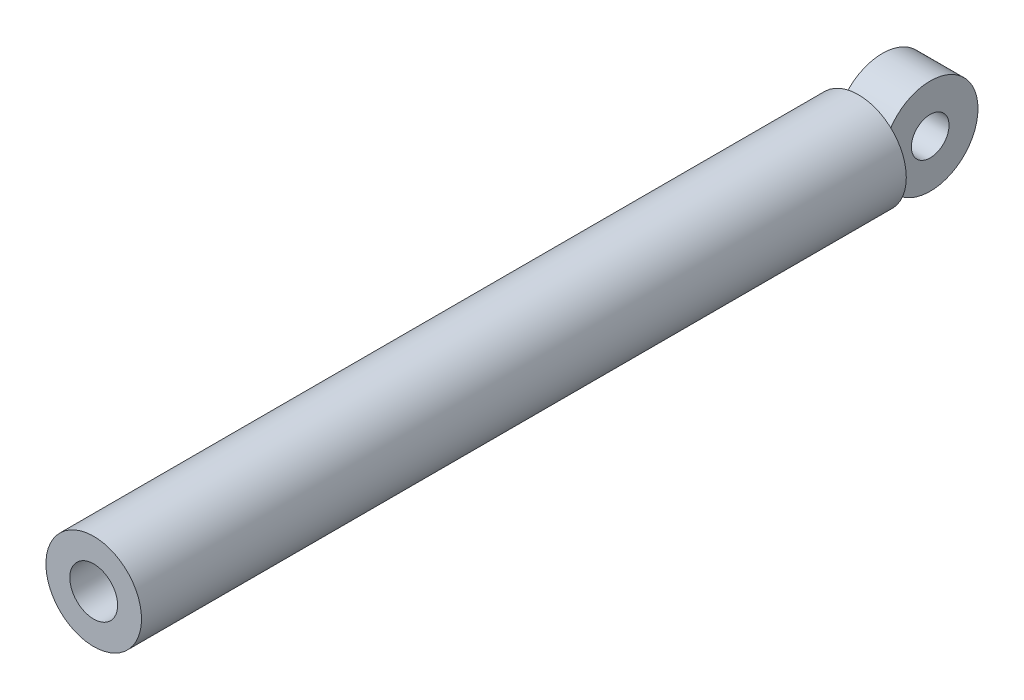
ISO-10303-21;
HEADER;
FILE_DESCRIPTION(('STEP AP214'),'2;1');
FILE_NAME('part.step','',(''),(''),'','','');
FILE_SCHEMA(('AUTOMOTIVE_DESIGN { 1 0 10303 214 1 1 1 1 }'));
ENDSEC;
DATA;
#1=APPLICATION_CONTEXT('core data for automotive mechanical design processes');
#2=APPLICATION_PROTOCOL_DEFINITION('international standard','automotive_design',2000,#1);
#3=PRODUCT_CONTEXT('',#1,'mechanical');
#4=PRODUCT('Part','Part','',(#3));
#5=PRODUCT_RELATED_PRODUCT_CATEGORY('part','',(#4));
#6=PRODUCT_DEFINITION_FORMATION('','',#4);
#7=PRODUCT_DEFINITION_CONTEXT('part definition',#1,'design');
#8=PRODUCT_DEFINITION('design','',#6,#7);
#9=PRODUCT_DEFINITION_SHAPE('','',#8);
#10=(LENGTH_UNIT() NAMED_UNIT(*) SI_UNIT(.MILLI.,.METRE.));
#11=(NAMED_UNIT(*) PLANE_ANGLE_UNIT() SI_UNIT($,.RADIAN.));
#12=(NAMED_UNIT(*) SI_UNIT($,.STERADIAN.) SOLID_ANGLE_UNIT());
#13=UNCERTAINTY_MEASURE_WITH_UNIT(LENGTH_MEASURE(1.E-05),#10,'distance_accuracy_value','');
#14=(GEOMETRIC_REPRESENTATION_CONTEXT(3) GLOBAL_UNCERTAINTY_ASSIGNED_CONTEXT((#13)) GLOBAL_UNIT_ASSIGNED_CONTEXT((#10,
#11,#12)) REPRESENTATION_CONTEXT('',''));
#15=CARTESIAN_POINT('',(0.,0.,0.));
#16=DIRECTION('',(0.,0.,1.));
#17=DIRECTION('',(1.,0.,0.));
#18=AXIS2_PLACEMENT_3D('',#15,#16,#17);
#19=CARTESIAN_POINT('',(3.175,0.,-6.35));
#20=DIRECTION('',(1.,0.,0.));
#21=DIRECTION('',(0.,0.,-1.));
#22=AXIS2_PLACEMENT_3D('',#19,#20,#21);
#23=PLANE('',#22);
#24=CARTESIAN_POINT('',(3.175,0.,-6.35));
#25=DIRECTION('',(1.,0.,0.));
#26=DIRECTION('',(0.,0.,-1.));
#27=AXIS2_PLACEMENT_3D('',#24,#25,#26);
#28=CIRCLE('',#27,6.35);
#29=CARTESIAN_POINT('',(3.175,0.,-12.7));
#30=VERTEX_POINT('',#29);
#31=EDGE_CURVE('E11',#30,#30,#28,.T.);
#32=ORIENTED_EDGE('',*,*,#31,.T.);
#33=EDGE_LOOP('',(#32));
#34=FACE_BOUND('',#33,.T.);
#35=CARTESIAN_POINT('',(3.175,0.,-6.35));
#36=DIRECTION('',(1.,0.,0.));
#37=DIRECTION('',(0.,0.,-1.));
#38=AXIS2_PLACEMENT_3D('',#35,#36,#37);
#39=CIRCLE('',#38,2.5);
#40=CARTESIAN_POINT('',(3.175,0.,-8.85));
#41=VERTEX_POINT('',#40);
#42=EDGE_CURVE('E56',#41,#41,#39,.T.);
#43=ORIENTED_EDGE('',*,*,#42,.F.);
#44=EDGE_LOOP('',(#43));
#45=FACE_BOUND('',#44,.T.);
#46=ADVANCED_FACE('F45',(#34,#45),#23,.T.);
#47=CARTESIAN_POINT('',(-3.175,0.,-6.35));
#48=DIRECTION('',(1.,0.,0.));
#49=DIRECTION('',(0.,0.,-1.));
#50=AXIS2_PLACEMENT_3D('',#47,#48,#49);
#51=PLANE('',#50);
#52=CARTESIAN_POINT('',(-3.175,0.,-6.35));
#53=DIRECTION('',(1.,0.,0.));
#54=DIRECTION('',(0.,0.,-1.));
#55=AXIS2_PLACEMENT_3D('',#52,#53,#54);
#56=CIRCLE('',#55,6.35);
#57=CARTESIAN_POINT('',(-3.175,0.,-12.7));
#58=VERTEX_POINT('',#57);
#59=EDGE_CURVE('E49',#58,#58,#56,.T.);
#60=ORIENTED_EDGE('',*,*,#59,.F.);
#61=EDGE_LOOP('',(#60));
#62=FACE_BOUND('',#61,.T.);
#63=CARTESIAN_POINT('',(-3.175,0.,-6.35));
#64=DIRECTION('',(1.,0.,0.));
#65=DIRECTION('',(0.,0.,-1.));
#66=AXIS2_PLACEMENT_3D('',#63,#64,#65);
#67=CIRCLE('',#66,2.5);
#68=CARTESIAN_POINT('',(-3.175,0.,-8.85));
#69=VERTEX_POINT('',#68);
#70=EDGE_CURVE('E58',#69,#69,#67,.T.);
#71=ORIENTED_EDGE('',*,*,#70,.T.);
#72=EDGE_LOOP('',(#71));
#73=FACE_BOUND('',#72,.T.);
#74=ADVANCED_FACE('F68',(#62,#73),#51,.F.);
#75=CARTESIAN_POINT('',(3.175,0.,-6.35));
#76=DIRECTION('',(-1.,0.,0.));
#77=DIRECTION('',(0.,0.,1.));
#78=AXIS2_PLACEMENT_3D('',#75,#76,#77);
#79=CYLINDRICAL_SURFACE('',#78,6.35);
#80=ORIENTED_EDGE('',*,*,#31,.F.);
#81=EDGE_LOOP('',(#80));
#82=FACE_BOUND('',#81,.T.);
#83=ORIENTED_EDGE('',*,*,#59,.T.);
#84=EDGE_LOOP('',(#83));
#85=FACE_BOUND('',#84,.T.);
#86=ADVANCED_FACE('F47',(#82,#85),#79,.T.);
#87=CARTESIAN_POINT('',(3.175,0.,-6.35));
#88=DIRECTION('',(-1.,0.,0.));
#89=DIRECTION('',(0.,0.,1.));
#90=AXIS2_PLACEMENT_3D('',#87,#88,#89);
#91=CYLINDRICAL_SURFACE('',#90,2.5);
#92=ORIENTED_EDGE('',*,*,#42,.T.);
#93=EDGE_LOOP('',(#92));
#94=FACE_BOUND('',#93,.T.);
#95=ORIENTED_EDGE('',*,*,#70,.F.);
#96=EDGE_LOOP('',(#95));
#97=FACE_BOUND('',#96,.T.);
#98=ADVANCED_FACE('F64',(#94,#97),#91,.F.);
#99=CLOSED_SHELL('',(#46,#74,#86,#98));
#100=MANIFOLD_SOLID_BREP('B2',#99);
#101=CARTESIAN_POINT('',(0.,0.,101.6));
#102=DIRECTION('',(0.,0.,-1.));
#103=DIRECTION('',(-1.,0.,0.));
#104=AXIS2_PLACEMENT_3D('',#101,#102,#103);
#105=CYLINDRICAL_SURFACE('',#104,6.35);
#106=CARTESIAN_POINT('',(0.,0.,101.6));
#107=DIRECTION('',(0.,0.,1.));
#108=DIRECTION('',(1.,0.,0.));
#109=AXIS2_PLACEMENT_3D('',#106,#107,#108);
#110=CIRCLE('',#109,6.35);
#111=CARTESIAN_POINT('',(6.35,0.,101.6));
#112=VERTEX_POINT('',#111);
#113=EDGE_CURVE('E44',#112,#112,#110,.T.);
#114=ORIENTED_EDGE('',*,*,#113,.F.);
#115=EDGE_LOOP('',(#114));
#116=FACE_BOUND('',#115,.T.);
#117=CARTESIAN_POINT('',(0.,0.,0.));
#118=DIRECTION('',(0.,0.,1.));
#119=DIRECTION('',(1.,0.,0.));
#120=AXIS2_PLACEMENT_3D('',#117,#118,#119);
#121=CIRCLE('',#120,6.35);
#122=CARTESIAN_POINT('',(6.35,0.,0.));
#123=VERTEX_POINT('',#122);
#124=EDGE_CURVE('E110',#123,#123,#121,.T.);
#125=ORIENTED_EDGE('',*,*,#124,.T.);
#126=EDGE_LOOP('',(#125));
#127=FACE_BOUND('',#126,.T.);
#128=ADVANCED_FACE('F107',(#116,#127),#105,.T.);
#129=CARTESIAN_POINT('',(0.,0.,101.6));
#130=DIRECTION('',(0.,0.,1.));
#131=DIRECTION('',(1.,0.,0.));
#132=AXIS2_PLACEMENT_3D('',#129,#130,#131);
#133=PLANE('',#132);
#134=CARTESIAN_POINT('',(0.,0.,101.6));
#135=DIRECTION('',(0.,0.,1.));
#136=DIRECTION('',(1.,0.,0.));
#137=AXIS2_PLACEMENT_3D('',#134,#135,#136);
#138=CIRCLE('',#137,3.175);
#139=CARTESIAN_POINT('',(3.175,0.,101.6));
#140=VERTEX_POINT('',#139);
#141=EDGE_CURVE('E119',#140,#140,#138,.T.);
#142=ORIENTED_EDGE('',*,*,#141,.F.);
#143=EDGE_LOOP('',(#142));
#144=FACE_BOUND('',#143,.T.);
#145=ORIENTED_EDGE('',*,*,#113,.T.);
#146=EDGE_LOOP('',(#145));
#147=FACE_BOUND('',#146,.T.);
#148=ADVANCED_FACE('F134',(#144,#147),#133,.T.);
#149=CARTESIAN_POINT('',(0.,0.,0.));
#150=DIRECTION('',(0.,0.,1.));
#151=DIRECTION('',(1.,0.,0.));
#152=AXIS2_PLACEMENT_3D('',#149,#150,#151);
#153=PLANE('',#152);
#154=ORIENTED_EDGE('',*,*,#124,.F.);
#155=EDGE_LOOP('',(#154));
#156=FACE_BOUND('',#155,.T.);
#157=ADVANCED_FACE('F130',(#156),#153,.F.);
#158=CARTESIAN_POINT('',(0.,0.,12.7));
#159=DIRECTION('',(0.,0.,1.));
#160=DIRECTION('',(1.,0.,0.));
#161=AXIS2_PLACEMENT_3D('',#158,#159,#160);
#162=CYLINDRICAL_SURFACE('',#161,3.175);
#163=CARTESIAN_POINT('',(0.,0.,12.7));
#164=DIRECTION('',(0.,0.,1.));
#165=DIRECTION('',(1.,0.,0.));
#166=AXIS2_PLACEMENT_3D('',#163,#164,#165);
#167=CIRCLE('',#166,3.175);
#168=CARTESIAN_POINT('',(3.175,0.,12.7));
#169=VERTEX_POINT('',#168);
#170=EDGE_CURVE('E117',#169,#169,#167,.T.);
#171=ORIENTED_EDGE('',*,*,#170,.F.);
#172=EDGE_LOOP('',(#171));
#173=FACE_BOUND('',#172,.T.);
#174=ORIENTED_EDGE('',*,*,#141,.T.);
#175=EDGE_LOOP('',(#174));
#176=FACE_BOUND('',#175,.T.);
#177=ADVANCED_FACE('F127',(#173,#176),#162,.F.);
#178=CARTESIAN_POINT('',(0.,0.,12.7));
#179=DIRECTION('',(0.,0.,1.));
#180=DIRECTION('',(1.,0.,0.));
#181=AXIS2_PLACEMENT_3D('',#178,#179,#180);
#182=PLANE('',#181);
#183=ORIENTED_EDGE('',*,*,#170,.T.);
#184=EDGE_LOOP('',(#183));
#185=FACE_BOUND('',#184,.T.);
#186=ADVANCED_FACE('F125',(#185),#182,.T.);
#187=CLOSED_SHELL('',(#128,#148,#157,#177,#186));
#188=MANIFOLD_SOLID_BREP('B6',#187);
#189=ADVANCED_BREP_SHAPE_REPRESENTATION('',(#18,#100,#188),#14);
#190=SHAPE_DEFINITION_REPRESENTATION(#9,#189);
ENDSEC;
END-ISO-10303-21;
